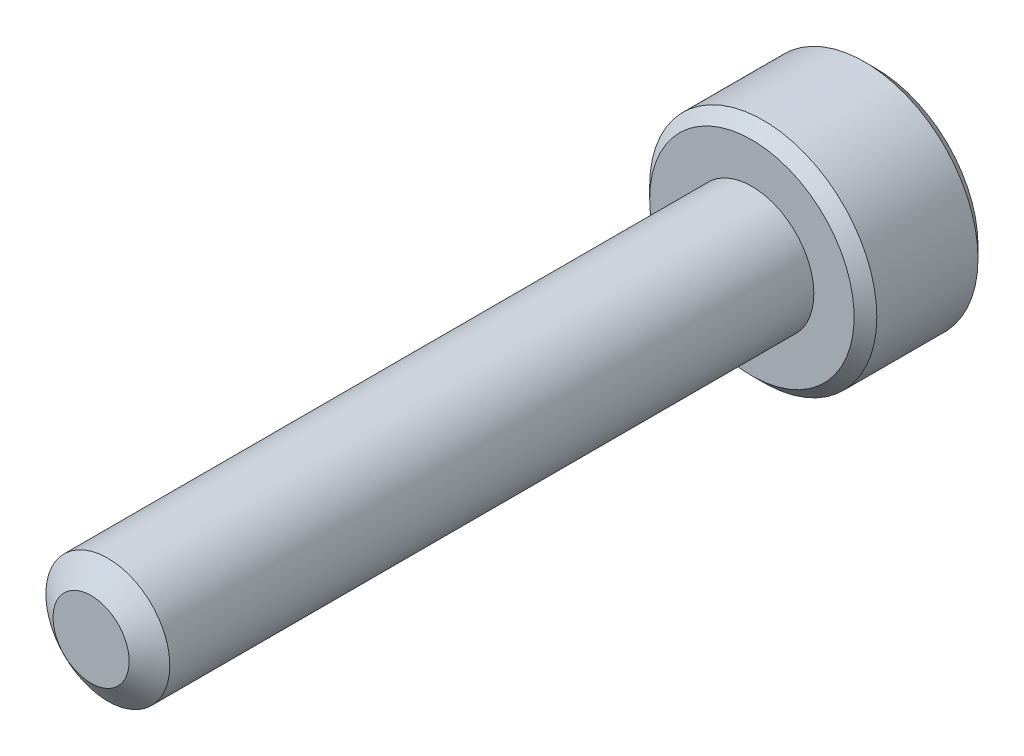
ISO-10303-21;
HEADER;
FILE_DESCRIPTION(('STEP AP214'),'2;1');
FILE_NAME('part.step','',(''),(''),'','','');
FILE_SCHEMA(('AUTOMOTIVE_DESIGN { 1 0 10303 214 1 1 1 1 }'));
ENDSEC;
DATA;
#1=APPLICATION_CONTEXT('core data for automotive mechanical design processes');
#2=APPLICATION_PROTOCOL_DEFINITION('international standard','automotive_design',2000,#1);
#3=PRODUCT_CONTEXT('',#1,'mechanical');
#4=PRODUCT('Part','Part','',(#3));
#5=PRODUCT_RELATED_PRODUCT_CATEGORY('part','',(#4));
#6=PRODUCT_DEFINITION_FORMATION('','',#4);
#7=PRODUCT_DEFINITION_CONTEXT('part definition',#1,'design');
#8=PRODUCT_DEFINITION('design','',#6,#7);
#9=PRODUCT_DEFINITION_SHAPE('','',#8);
#10=(LENGTH_UNIT() NAMED_UNIT(*) SI_UNIT(.MILLI.,.METRE.));
#11=(NAMED_UNIT(*) PLANE_ANGLE_UNIT() SI_UNIT($,.RADIAN.));
#12=(NAMED_UNIT(*) SI_UNIT($,.STERADIAN.) SOLID_ANGLE_UNIT());
#13=UNCERTAINTY_MEASURE_WITH_UNIT(LENGTH_MEASURE(1.E-05),#10,'distance_accuracy_value','');
#14=(GEOMETRIC_REPRESENTATION_CONTEXT(3) GLOBAL_UNCERTAINTY_ASSIGNED_CONTEXT((#13)) GLOBAL_UNIT_ASSIGNED_CONTEXT((#10,
#11,#12)) REPRESENTATION_CONTEXT('',''));
#15=CARTESIAN_POINT('',(0.,0.,0.));
#16=DIRECTION('',(0.,0.,1.));
#17=DIRECTION('',(1.,0.,0.));
#18=AXIS2_PLACEMENT_3D('',#15,#16,#17);
#19=CARTESIAN_POINT('',(0.,0.,-16.));
#20=DIRECTION('',(0.,0.,1.));
#21=DIRECTION('',(1.,0.,0.));
#22=AXIS2_PLACEMENT_3D('',#19,#20,#21);
#23=CYLINDRICAL_SURFACE('',#22,1.5);
#24=CARTESIAN_POINT('',(0.,0.,-16.));
#25=DIRECTION('',(0.,0.,-1.));
#26=DIRECTION('',(-1.,0.,0.));
#27=AXIS2_PLACEMENT_3D('',#24,#25,#26);
#28=CIRCLE('',#27,1.5);
#29=CARTESIAN_POINT('',(-1.5,0.,-16.));
#30=VERTEX_POINT('',#29);
#31=EDGE_CURVE('E218',#30,#30,#28,.F.);
#32=ORIENTED_EDGE('',*,*,#31,.T.);
#33=EDGE_LOOP('',(#32));
#34=FACE_BOUND('',#33,.T.);
#35=CARTESIAN_POINT('',(0.,0.,-0.40525178320938));
#36=DIRECTION('',(0.,0.,1.));
#37=DIRECTION('',(1.,0.,0.));
#38=AXIS2_PLACEMENT_3D('',#35,#36,#37);
#39=CIRCLE('',#38,1.5);
#40=CARTESIAN_POINT('',(1.5,0.,-0.40525178320938));
#41=VERTEX_POINT('',#40);
#42=EDGE_CURVE('E112',#41,#41,#39,.T.);
#43=ORIENTED_EDGE('',*,*,#42,.F.);
#44=EDGE_LOOP('',(#43));
#45=FACE_BOUND('',#44,.T.);
#46=ADVANCED_FACE('F38',(#34,#45),#23,.T.);
#47=CARTESIAN_POINT('',(0.,0.,0.));
#48=DIRECTION('',(0.,0.,-1.));
#49=DIRECTION('',(-1.,0.,0.));
#50=AXIS2_PLACEMENT_3D('',#47,#48,#49);
#51=CONICAL_SURFACE('',#50,0.921240473580834,0.959931088596884);
#52=ORIENTED_EDGE('',*,*,#42,.T.);
#53=EDGE_LOOP('',(#52));
#54=FACE_BOUND('',#53,.T.);
#55=CARTESIAN_POINT('',(0.,0.,0.));
#56=DIRECTION('',(0.,0.,1.));
#57=DIRECTION('',(1.,0.,0.));
#58=AXIS2_PLACEMENT_3D('',#55,#56,#57);
#59=CIRCLE('',#58,0.921240473580834);
#60=CARTESIAN_POINT('',(0.921240473580834,0.,0.));
#61=VERTEX_POINT('',#60);
#62=EDGE_CURVE('E216',#61,#61,#59,.T.);
#63=ORIENTED_EDGE('',*,*,#62,.F.);
#64=EDGE_LOOP('',(#63));
#65=FACE_BOUND('',#64,.T.);
#66=ADVANCED_FACE('F199',(#54,#65),#51,.T.);
#67=CARTESIAN_POINT('',(0.,0.,0.));
#68=DIRECTION('',(0.,0.,1.));
#69=DIRECTION('',(1.,0.,0.));
#70=AXIS2_PLACEMENT_3D('',#67,#68,#69);
#71=PLANE('',#70);
#72=ORIENTED_EDGE('',*,*,#62,.T.);
#73=EDGE_LOOP('',(#72));
#74=FACE_BOUND('',#73,.T.);
#75=ADVANCED_FACE('F196',(#74),#71,.T.);
#76=CARTESIAN_POINT('',(0.,0.,-19.));
#77=DIRECTION('',(0.,0.,1.));
#78=DIRECTION('',(1.,0.,0.));
#79=AXIS2_PLACEMENT_3D('',#76,#77,#78);
#80=CYLINDRICAL_SURFACE('',#79,2.75);
#81=CARTESIAN_POINT('',(0.,0.,-18.725));
#82=DIRECTION('',(0.,0.,-1.));
#83=DIRECTION('',(-1.,0.,0.));
#84=AXIS2_PLACEMENT_3D('',#81,#82,#83);
#85=CIRCLE('',#84,2.75);
#86=CARTESIAN_POINT('',(2.75,0.,-18.725));
#87=VERTEX_POINT('',#86);
#88=EDGE_CURVE('E46',#87,#87,#85,.F.);
#89=CARTESIAN_POINT('',(0.,0.,-16.275));
#90=DIRECTION('',(0.,0.,-1.));
#91=DIRECTION('',(-1.,0.,0.));
#92=AXIS2_PLACEMENT_3D('',#89,#90,#91);
#93=CIRCLE('',#92,2.75);
#94=CARTESIAN_POINT('',(2.75,0.,-16.275));
#95=VERTEX_POINT('',#94);
#96=EDGE_CURVE('E175',#95,#95,#93,.T.);
#97=CARTESIAN_POINT('',(2.75,0.,-18.725));
#98=CARTESIAN_POINT('',(2.75,0.,-18.6994791666667));
#99=CARTESIAN_POINT('',(2.75,0.,-18.6739583333333));
#100=CARTESIAN_POINT('',(2.75,0.,-18.6229166666667));
#101=CARTESIAN_POINT('',(2.75,0.,-18.5973958333333));
#102=CARTESIAN_POINT('',(2.75,0.,-18.5463541666667));
#103=CARTESIAN_POINT('',(2.75,0.,-18.5208333333333));
#104=CARTESIAN_POINT('',(2.75,0.,-18.4697916666667));
#105=CARTESIAN_POINT('',(2.75,0.,-18.4442708333333));
#106=CARTESIAN_POINT('',(2.75,0.,-18.3932291666667));
#107=CARTESIAN_POINT('',(2.75,0.,-18.3677083333333));
#108=CARTESIAN_POINT('',(2.75,0.,-18.3166666666667));
#109=CARTESIAN_POINT('',(2.75,0.,-18.2911458333333));
#110=CARTESIAN_POINT('',(2.75,0.,-18.2401041666667));
#111=CARTESIAN_POINT('',(2.75,0.,-18.2145833333333));
#112=CARTESIAN_POINT('',(2.75,0.,-18.1635416666667));
#113=CARTESIAN_POINT('',(2.75,0.,-18.1380208333333));
#114=CARTESIAN_POINT('',(2.75,0.,-18.0869791666667));
#115=CARTESIAN_POINT('',(2.75,0.,-18.0614583333333));
#116=CARTESIAN_POINT('',(2.75,0.,-18.0104166666667));
#117=CARTESIAN_POINT('',(2.75,0.,-17.9848958333333));
#118=CARTESIAN_POINT('',(2.75,0.,-17.9338541666667));
#119=CARTESIAN_POINT('',(2.75,0.,-17.9083333333333));
#120=CARTESIAN_POINT('',(2.75,0.,-17.8572916666667));
#121=CARTESIAN_POINT('',(2.75,0.,-17.8317708333333));
#122=CARTESIAN_POINT('',(2.75,0.,-17.7807291666667));
#123=CARTESIAN_POINT('',(2.75,0.,-17.7552083333333));
#124=CARTESIAN_POINT('',(2.75,0.,-17.7041666666667));
#125=CARTESIAN_POINT('',(2.75,0.,-17.6786458333333));
#126=CARTESIAN_POINT('',(2.75,0.,-17.6276041666667));
#127=CARTESIAN_POINT('',(2.75,0.,-17.6020833333333));
#128=CARTESIAN_POINT('',(2.75,0.,-17.5510416666667));
#129=CARTESIAN_POINT('',(2.75,0.,-17.5255208333333));
#130=CARTESIAN_POINT('',(2.75,0.,-17.4744791666667));
#131=CARTESIAN_POINT('',(2.75,0.,-17.4489583333333));
#132=CARTESIAN_POINT('',(2.75,0.,-17.3979166666667));
#133=CARTESIAN_POINT('',(2.75,0.,-17.3723958333333));
#134=CARTESIAN_POINT('',(2.75,0.,-17.3213541666667));
#135=CARTESIAN_POINT('',(2.75,0.,-17.2958333333333));
#136=CARTESIAN_POINT('',(2.75,0.,-17.2447916666667));
#137=CARTESIAN_POINT('',(2.75,0.,-17.2192708333333));
#138=CARTESIAN_POINT('',(2.75,0.,-17.1682291666667));
#139=CARTESIAN_POINT('',(2.75,0.,-17.1427083333333));
#140=CARTESIAN_POINT('',(2.75,0.,-17.0916666666667));
#141=CARTESIAN_POINT('',(2.75,0.,-17.0661458333333));
#142=CARTESIAN_POINT('',(2.75,0.,-17.0151041666667));
#143=CARTESIAN_POINT('',(2.75,0.,-16.9895833333333));
#144=CARTESIAN_POINT('',(2.75,0.,-16.9385416666667));
#145=CARTESIAN_POINT('',(2.75,0.,-16.9130208333333));
#146=CARTESIAN_POINT('',(2.75,0.,-16.8619791666667));
#147=CARTESIAN_POINT('',(2.75,0.,-16.8364583333333));
#148=CARTESIAN_POINT('',(2.75,0.,-16.7854166666667));
#149=CARTESIAN_POINT('',(2.75,0.,-16.7598958333333));
#150=CARTESIAN_POINT('',(2.75,0.,-16.7088541666667));
#151=CARTESIAN_POINT('',(2.75,0.,-16.6833333333333));
#152=CARTESIAN_POINT('',(2.75,0.,-16.6322916666667));
#153=CARTESIAN_POINT('',(2.75,0.,-16.6067708333333));
#154=CARTESIAN_POINT('',(2.75,0.,-16.5557291666667));
#155=CARTESIAN_POINT('',(2.75,0.,-16.5302083333333));
#156=CARTESIAN_POINT('',(2.75,0.,-16.4791666666667));
#157=CARTESIAN_POINT('',(2.75,0.,-16.4536458333333));
#158=CARTESIAN_POINT('',(2.75,0.,-16.4026041666667));
#159=CARTESIAN_POINT('',(2.75,0.,-16.3770833333333));
#160=CARTESIAN_POINT('',(2.75,0.,-16.3260416666667));
#161=CARTESIAN_POINT('',(2.75,0.,-16.3005208333333));
#162=CARTESIAN_POINT('',(2.75,0.,-16.275));
#163=B_SPLINE_CURVE_WITH_KNOTS('',3,(#97,#98,#99,#100,#101,#102,#103,#104,#105,#106,#107,#108,
#109,#110,#111,#112,#113,#114,#115,#116,#117,#118,#119,#120,#121,#122,#123,#124,#125,#126,#127,
#128,#129,#130,#131,#132,#133,#134,#135,#136,#137,#138,#139,#140,#141,#142,#143,#144,#145,#146,
#147,#148,#149,#150,#151,#152,#153,#154,#155,#156,#157,#158,#159,#160,#161,#162),.UNSPECIFIED.,
.F.,.F.,(4,2,2,2,2,2,2,2,2,2,2,2,2,2,2,2,2,2,2,2,2,2,2,2,2,2,2,2,2,2,2,2,4),(0.,
0.076562500000002,0.153125,0.229687500000002,0.306250000000001,0.382812500000003,
0.459375000000001,0.5359375,0.612500000000002,0.6890625,0.765625000000002,0.842187500000001,
0.918749999999999,0.995312500000001,1.071875,1.1484375,1.225,1.3015625,1.378125,1.4546875,
1.53125,1.6078125,1.684375,1.7609375,1.8375,1.9140625,1.990625,2.0671875,2.14375,2.2203125,
2.296875,2.3734375,2.45),.UNSPECIFIED.);
#164=EDGE_CURVE('BSEAM180',#87,#95,#163,.T.);
#165=ORIENTED_EDGE('',*,*,#88,.T.);
#166=ORIENTED_EDGE('',*,*,#96,.T.);
#167=ORIENTED_EDGE('',*,*,#164,.T.);
#168=ORIENTED_EDGE('',*,*,#164,.F.);
#169=EDGE_LOOP('',(#165,#167,#166,#168));
#170=FACE_BOUND('',#169,.T.);
#171=ADVANCED_FACE('F180',(#170),#80,.T.);
#172=CARTESIAN_POINT('',(0.,0.,-19.));
#173=DIRECTION('',(0.,0.,-1.));
#174=DIRECTION('',(-1.,0.,0.));
#175=AXIS2_PLACEMENT_3D('',#172,#173,#174);
#176=PLANE('',#175);
#177=CARTESIAN_POINT('',(0.,0.,-19.));
#178=DIRECTION('',(0.,0.,-1.));
#179=DIRECTION('',(-1.,0.,0.));
#180=AXIS2_PLACEMENT_3D('',#177,#178,#179);
#181=CIRCLE('',#180,2.475);
#182=CARTESIAN_POINT('',(2.475,0.,-19.));
#183=VERTEX_POINT('',#182);
#184=EDGE_CURVE('E111',#183,#183,#181,.T.);
#185=ORIENTED_EDGE('',*,*,#184,.T.);
#186=EDGE_LOOP('',(#185));
#187=FACE_BOUND('',#186,.T.);
#188=CARTESIAN_POINT('',(0.,0.,-19.));
#189=DIRECTION('',(0.,0.,-1.));
#190=DIRECTION('',(-1.,0.,0.));
#191=AXIS2_PLACEMENT_3D('',#188,#189,#190);
#192=CIRCLE('',#191,1.44337567297406);
#193=CARTESIAN_POINT('',(-1.25,0.721687836487031,-19.));
#194=VERTEX_POINT('',#193);
#195=CARTESIAN_POINT('',(0.,1.44337567297406,-19.));
#196=VERTEX_POINT('',#195);
#197=EDGE_CURVE('E92',#194,#196,#192,.T.);
#198=ORIENTED_EDGE('',*,*,#197,.F.);
#199=CARTESIAN_POINT('',(-1.25,-0.721687836487032,-19.));
#200=VERTEX_POINT('',#199);
#201=EDGE_CURVE('E52',#200,#194,#192,.T.);
#202=ORIENTED_EDGE('',*,*,#201,.F.);
#203=CARTESIAN_POINT('',(0.,-1.44337567297406,-19.));
#204=VERTEX_POINT('',#203);
#205=EDGE_CURVE('E277',#204,#200,#192,.T.);
#206=ORIENTED_EDGE('',*,*,#205,.F.);
#207=CARTESIAN_POINT('',(1.25,-0.721687836487032,-19.));
#208=VERTEX_POINT('',#207);
#209=EDGE_CURVE('E59',#208,#204,#192,.T.);
#210=ORIENTED_EDGE('',*,*,#209,.F.);
#211=CARTESIAN_POINT('',(1.25,0.721687836487033,-19.));
#212=VERTEX_POINT('',#211);
#213=EDGE_CURVE('E133',#212,#208,#192,.T.);
#214=ORIENTED_EDGE('',*,*,#213,.F.);
#215=EDGE_CURVE('E101',#196,#212,#192,.T.);
#216=ORIENTED_EDGE('',*,*,#215,.F.);
#217=EDGE_LOOP('',(#198,#202,#206,#210,#214,#216));
#218=FACE_BOUND('',#217,.T.);
#219=ADVANCED_FACE('F132',(#187,#218),#176,.T.);
#220=CARTESIAN_POINT('',(0.,0.,-16.));
#221=DIRECTION('',(0.,0.,-1.));
#222=DIRECTION('',(-1.,0.,0.));
#223=AXIS2_PLACEMENT_3D('',#220,#221,#222);
#224=PLANE('',#223);
#225=CARTESIAN_POINT('',(0.,0.,-16.));
#226=DIRECTION('',(0.,0.,-1.));
#227=DIRECTION('',(-1.,0.,0.));
#228=AXIS2_PLACEMENT_3D('',#225,#226,#227);
#229=CIRCLE('',#228,2.475);
#230=CARTESIAN_POINT('',(-2.475,0.,-16.));
#231=VERTEX_POINT('',#230);
#232=EDGE_CURVE('E11',#231,#231,#229,.F.);
#233=ORIENTED_EDGE('',*,*,#232,.T.);
#234=EDGE_LOOP('',(#233));
#235=FACE_BOUND('',#234,.T.);
#236=ORIENTED_EDGE('',*,*,#31,.F.);
#237=EDGE_LOOP('',(#236));
#238=FACE_BOUND('',#237,.T.);
#239=ADVANCED_FACE('F189',(#235,#238),#224,.F.);
#240=CARTESIAN_POINT('',(0.,0.,-19.));
#241=DIRECTION('',(0.,0.,-1.));
#242=DIRECTION('',(-1.,0.,0.));
#243=AXIS2_PLACEMENT_3D('',#240,#241,#242);
#244=CONICAL_SURFACE('',#243,1.44337567297406,0.78539816339745);
#245=ORIENTED_EDGE('',*,*,#215,.T.);
#246=CARTESIAN_POINT('',(-0.000200000000000119,1.4434911430279,-19.0001154839091));
#247=CARTESIAN_POINT('',(0.0427751670715865,1.41867941875065,-18.9753216680551));
#248=CARTESIAN_POINT('',(0.0864690047459473,1.39345276980743,-18.9519837344187));
#249=CARTESIAN_POINT('',(0.17556593084194,1.34201263554194,-18.9092520040845));
#250=CARTESIAN_POINT('',(0.220977498357062,1.31579425481276,-18.8898819923604));
#251=CARTESIAN_POINT('',(0.312547820935257,1.26292610442246,-18.8567004834135));
#252=CARTESIAN_POINT('',(0.358683240175883,1.23628980770471,-18.8428055590527));
#253=CARTESIAN_POINT('',(0.451970080407589,1.18243062538509,-18.8213972821606));
#254=CARTESIAN_POINT('',(0.499118649136376,1.15520938653762,-18.8138679415668));
#255=CARTESIAN_POINT('',(0.580373556887248,1.10829684367467,-18.8070744980507));
#256=CARTESIAN_POINT('',(0.614374876627936,1.08866617256958,-18.8060685591044));
#257=CARTESIAN_POINT('',(0.682317764432473,1.04943932800611,-18.8077614149113));
#258=CARTESIAN_POINT('',(0.716259317655653,1.029843163116,-18.8104610272155));
#259=CARTESIAN_POINT('',(0.783814856457495,0.990839954603502,-18.8194089303164));
#260=CARTESIAN_POINT('',(0.81742850728677,0.971433104248774,-18.8256605258997));
#261=CARTESIAN_POINT('',(0.884094638217808,0.932943395609908,-18.8413756814139));
#262=CARTESIAN_POINT('',(0.917146871030291,0.913860680098303,-18.8508406200875));
#263=CARTESIAN_POINT('',(1.00179969160026,0.86498635135457,-18.8789313906876));
#264=CARTESIAN_POINT('',(1.05286649242963,0.835502920149078,-18.8996701574522));
#265=CARTESIAN_POINT('',(1.15300085411325,0.777690319475909,-18.9463871346715));
#266=CARTESIAN_POINT('',(1.20207431157827,0.749357745598417,-18.9723482959468));
#267=CARTESIAN_POINT('',(1.2502,0.721572366433194,-19.0001154839091));
#268=B_SPLINE_CURVE_WITH_KNOTS('',3,(#246,#247,#248,#249,#250,#251,#252,#253,#254,#255,#256,
#257,#258,#259,#260,#261,#262,#263,#264,#265,#266,#267),.UNSPECIFIED.,.F.,.F.,(4,2,2,2,2,2,2,2,
2,2,4),(0.,0.166533409618302,0.33403760728976,0.498880396489694,0.66330791924027,
0.780963963458822,0.898645970148448,1.01643764860773,1.13427993171549,1.32148652032141,
1.50809158792574),.UNSPECIFIED.);
#269=EDGE_CURVE('E106',#196,#212,#268,.T.);
#270=ORIENTED_EDGE('',*,*,#269,.F.);
#271=EDGE_LOOP('',(#245,#270));
#272=FACE_BOUND('',#271,.T.);
#273=ADVANCED_FACE('F107',(#272),#244,.F.);
#274=ORIENTED_EDGE('',*,*,#213,.T.);
#275=CARTESIAN_POINT('',(1.25,-1.43934010808077,-19.4629820968923));
#276=CARTESIAN_POINT('',(1.25,-1.40429313005659,-19.4365249226329));
#277=CARTESIAN_POINT('',(1.25,-1.36905087135599,-19.4103271603543));
#278=CARTESIAN_POINT('',(1.25,-1.29809650706311,-19.3585575718396));
#279=CARTESIAN_POINT('',(1.25,-1.26238428576496,-19.3329859043563));
#280=CARTESIAN_POINT('',(1.25,-1.15390111792708,-19.2570059936895));
#281=CARTESIAN_POINT('',(1.25,-1.08031646726264,-19.2077402861896));
#282=CARTESIAN_POINT('',(1.25,-0.926012322755096,-19.1110258302631));
#283=CARTESIAN_POINT('',(1.25,-0.845125318656147,-19.0638412989418));
#284=CARTESIAN_POINT('',(1.25,-0.679311174076602,-18.9775307343904));
#285=CARTESIAN_POINT('',(1.25,-0.594398891026687,-18.9383775346269));
#286=CARTESIAN_POINT('',(1.25,-0.46694481246074,-18.8904772236883));
#287=CARTESIAN_POINT('',(1.25,-0.426289985812822,-18.8767294897863));
#288=CARTESIAN_POINT('',(1.25,-0.343998850091267,-18.8524979274505));
#289=CARTESIAN_POINT('',(1.25,-0.302362473614961,-18.8420143238698));
#290=CARTESIAN_POINT('',(1.25,-0.219052696285665,-18.8250301617483));
#291=CARTESIAN_POINT('',(1.25,-0.177393428474499,-18.8184613604714));
#292=CARTESIAN_POINT('',(1.25,-0.093629369340192,-18.8094350534578));
#293=CARTESIAN_POINT('',(1.25,-0.051524655854396,-18.8069768409973));
#294=CARTESIAN_POINT('',(1.25,0.0311890576306313,-18.8063540620133));
#295=CARTESIAN_POINT('',(1.25,0.07179696254993,-18.8080371168462));
#296=CARTESIAN_POINT('',(1.25,0.152668636885197,-18.8152682705979));
#297=CARTESIAN_POINT('',(1.25,0.192932338835358,-18.8208171104131));
#298=CARTESIAN_POINT('',(1.25,0.273499879165295,-18.835571036465));
#299=CARTESIAN_POINT('',(1.25,0.31379218061851,-18.8448381759641));
#300=CARTESIAN_POINT('',(1.25,0.393496413911457,-18.8665361784573));
#301=CARTESIAN_POINT('',(1.25,0.432908419115059,-18.8789667767306));
#302=CARTESIAN_POINT('',(1.25,0.556992735862299,-18.9227793529314));
#303=CARTESIAN_POINT('',(1.25,0.639898924666086,-18.959151072876));
#304=CARTESIAN_POINT('',(1.25,0.801816555499702,-19.0400191621783));
#305=CARTESIAN_POINT('',(1.25,0.880812666325045,-19.084544720912));
#306=CARTESIAN_POINT('',(1.25,1.0317856127975,-19.1764048766666));
#307=CARTESIAN_POINT('',(1.25,1.10391618485086,-19.2234899339162));
#308=CARTESIAN_POINT('',(1.25,1.21018606043311,-19.2962785615985));
#309=CARTESIAN_POINT('',(1.25,1.24515069969379,-19.3207980853934));
#310=CARTESIAN_POINT('',(1.25,1.31460220852737,-19.3704856367657));
#311=CARTESIAN_POINT('',(1.25,1.34908920596618,-19.3956534854155));
#312=CARTESIAN_POINT('',(1.25,1.38337731682912,-19.4210901488412));
#313=B_SPLINE_CURVE_WITH_KNOTS('',3,(#275,#276,#277,#278,#279,#280,#281,#282,#283,#284,#285,
#286,#287,#288,#289,#290,#291,#292,#293,#294,#295,#296,#297,#298,#299,#300,#301,#302,#303,#304,
#305,#306,#307,#308,#309,#310,#311,#312),.UNSPECIFIED.,.F.,.F.,(4,2,2,2,2,2,2,2,2,2,2,2,2,2,2,2,
2,2,4),(0.,0.131732960381448,0.263498984161645,0.529042014455827,0.809741926134622,
1.08947609717225,1.21811634272577,1.34676544783901,1.47310084517844,1.59941451973785,
1.7211504216785,1.84290966131735,1.96679153905342,2.09066305366039,2.36146692896009,
2.63325989198491,2.8915466821228,3.01965734507713,3.14773302245628),.UNSPECIFIED.);
#314=EDGE_CURVE('E100',#212,#208,#313,.F.);
#315=ORIENTED_EDGE('',*,*,#314,.F.);
#316=EDGE_LOOP('',(#274,#315));
#317=FACE_BOUND('',#316,.T.);
#318=ADVANCED_FACE('F283',(#317),#244,.F.);
#319=ORIENTED_EDGE('',*,*,#209,.T.);
#320=CARTESIAN_POINT('',(1.2502,-0.721572366433195,-19.0001154839091));
#321=CARTESIAN_POINT('',(1.20722483292841,-0.746384090710444,-18.9753216680551));
#322=CARTESIAN_POINT('',(1.16353099525405,-0.771610739653665,-18.9519837344187));
#323=CARTESIAN_POINT('',(1.07443406915806,-0.823050873919155,-18.9092520040845));
#324=CARTESIAN_POINT('',(1.02902250164294,-0.849269254648333,-18.8898819923604));
#325=CARTESIAN_POINT('',(0.93745217906474,-0.902137405038636,-18.8567004834135));
#326=CARTESIAN_POINT('',(0.891316759824114,-0.928773701756388,-18.8428055590527));
#327=CARTESIAN_POINT('',(0.798029919592407,-0.982632884076014,-18.8213972821606));
#328=CARTESIAN_POINT('',(0.750881350863619,-1.00985412292348,-18.8138679415668));
#329=CARTESIAN_POINT('',(0.669626443112747,-1.05676666578643,-18.8070744980507));
#330=CARTESIAN_POINT('',(0.635625123372058,-1.07639733689152,-18.8060685591044));
#331=CARTESIAN_POINT('',(0.567682235567521,-1.11562418145499,-18.8077614149113));
#332=CARTESIAN_POINT('',(0.533740682344341,-1.1352203463451,-18.8104610272155));
#333=CARTESIAN_POINT('',(0.466185143542499,-1.1742235548576,-18.8194089303164));
#334=CARTESIAN_POINT('',(0.432571492713224,-1.19363040521233,-18.8256605258997));
#335=CARTESIAN_POINT('',(0.365905361782186,-1.23212011385119,-18.8413756814139));
#336=CARTESIAN_POINT('',(0.332853128969703,-1.2512028293628,-18.8508406200875));
#337=CARTESIAN_POINT('',(0.248200308399734,-1.30007715810653,-18.8789313906876));
#338=CARTESIAN_POINT('',(0.19713350757036,-1.32956058931202,-18.8996701574522));
#339=CARTESIAN_POINT('',(0.0969991458867441,-1.38737318998519,-18.9463871346715));
#340=CARTESIAN_POINT('',(0.0479256884217299,-1.41570576386268,-18.9723482959468));
#341=CARTESIAN_POINT('',(-0.000199999999999849,-1.4434911430279,-19.0001154839091));
#342=B_SPLINE_CURVE_WITH_KNOTS('',3,(#320,#321,#322,#323,#324,#325,#326,#327,#328,#329,#330,
#331,#332,#333,#334,#335,#336,#337,#338,#339,#340,#341),.UNSPECIFIED.,.F.,.F.,(4,2,2,2,2,2,2,2,
2,2,4),(0.,0.166533409618303,0.334037607289763,0.4988803964897,0.663307919240276,
0.780963963458829,0.898645970148455,1.01643764860773,1.1342799317155,1.32148652032141,
1.50809158792574),.UNSPECIFIED.);
#343=EDGE_CURVE('E143',#208,#204,#342,.T.);
#344=ORIENTED_EDGE('',*,*,#343,.F.);
#345=EDGE_LOOP('',(#319,#344));
#346=FACE_BOUND('',#345,.T.);
#347=ADVANCED_FACE('F280',(#346),#244,.F.);
#348=ORIENTED_EDGE('',*,*,#205,.T.);
#349=CARTESIAN_POINT('',(0.000200000000000315,-1.4434911430279,-19.0001154839091));
#350=CARTESIAN_POINT('',(-0.0427751670715866,-1.41867941875065,-18.9753216680551));
#351=CARTESIAN_POINT('',(-0.0864690047459478,-1.39345276980743,-18.9519837344187));
#352=CARTESIAN_POINT('',(-0.175565930841942,-1.34201263554194,-18.9092520040845));
#353=CARTESIAN_POINT('',(-0.220977498357064,-1.31579425481276,-18.8898819923604));
#354=CARTESIAN_POINT('',(-0.31254782093526,-1.26292610442246,-18.8567004834135));
#355=CARTESIAN_POINT('',(-0.358683240175886,-1.23628980770471,-18.8428055590527));
#356=CARTESIAN_POINT('',(-0.451970080407593,-1.18243062538508,-18.8213972821606));
#357=CARTESIAN_POINT('',(-0.49911864913638,-1.15520938653761,-18.8138679415668));
#358=CARTESIAN_POINT('',(-0.580373556887253,-1.10829684367467,-18.8070744980507));
#359=CARTESIAN_POINT('',(-0.614374876627942,-1.08866617256958,-18.8060685591044));
#360=CARTESIAN_POINT('',(-0.682317764432478,-1.04943932800611,-18.8077614149113));
#361=CARTESIAN_POINT('',(-0.716259317655658,-1.02984316311599,-18.8104610272155));
#362=CARTESIAN_POINT('',(-0.783814856457501,-0.990839954603499,-18.8194089303164));
#363=CARTESIAN_POINT('',(-0.817428507286776,-0.971433104248771,-18.8256605258997));
#364=CARTESIAN_POINT('',(-0.884094638217814,-0.932943395609905,-18.8413756814139));
#365=CARTESIAN_POINT('',(-0.917146871030296,-0.9138606800983,-18.8508406200875));
#366=CARTESIAN_POINT('',(-1.00179969160027,-0.864986351354568,-18.8789313906876));
#367=CARTESIAN_POINT('',(-1.05286649242964,-0.835502920149076,-18.8996701574522));
#368=CARTESIAN_POINT('',(-1.15300085411326,-0.777690319475908,-18.9463871346715));
#369=CARTESIAN_POINT('',(-1.20207431157827,-0.749357745598416,-18.9723482959468));
#370=CARTESIAN_POINT('',(-1.2502,-0.721572366433194,-19.0001154839091));
#371=B_SPLINE_CURVE_WITH_KNOTS('',3,(#349,#350,#351,#352,#353,#354,#355,#356,#357,#358,#359,
#360,#361,#362,#363,#364,#365,#366,#367,#368,#369,#370),.UNSPECIFIED.,.F.,.F.,(4,2,2,2,2,2,2,2,
2,2,4),(0.,0.166533409618304,0.334037607289763,0.498880396489699,0.663307919240276,
0.780963963458828,0.898645970148455,1.01643764860773,1.1342799317155,1.32148652032141,
1.50809158792574),.UNSPECIFIED.);
#372=EDGE_CURVE('E254',#204,#200,#371,.T.);
#373=ORIENTED_EDGE('',*,*,#372,.F.);
#374=EDGE_LOOP('',(#348,#373));
#375=FACE_BOUND('',#374,.T.);
#376=ADVANCED_FACE('F279',(#375),#244,.F.);
#377=ORIENTED_EDGE('',*,*,#201,.T.);
#378=CARTESIAN_POINT('',(-1.25,-1.43934010829019,-19.4629820970504));
#379=CARTESIAN_POINT('',(-1.25,-1.40429313026013,-19.4365249227849));
#380=CARTESIAN_POINT('',(-1.25,-1.36905087155364,-19.4103271605002));
#381=CARTESIAN_POINT('',(-1.25,-1.29809650724891,-19.3585575719734));
#382=CARTESIAN_POINT('',(-1.25,-1.2623842859448,-19.3329859044841));
#383=CARTESIAN_POINT('',(-1.25,-1.1539011180887,-19.257005993799));
#384=CARTESIAN_POINT('',(-1.25,-1.08031646741188,-19.207740286287));
#385=CARTESIAN_POINT('',(-1.25,-0.926012322877301,-19.1110258303356));
#386=CARTESIAN_POINT('',(-1.25,-0.845125318763647,-19.0638412990016));
#387=CARTESIAN_POINT('',(-1.25,-0.679311174153443,-18.9775307344266));
#388=CARTESIAN_POINT('',(-1.25,-0.594398891087584,-18.9383775346522));
#389=CARTESIAN_POINT('',(-1.25,-0.46694481250964,-18.8904772237056));
#390=CARTESIAN_POINT('',(-1.25,-0.426289985866745,-18.8767294898039));
#391=CARTESIAN_POINT('',(-1.25,-0.343998850155403,-18.8524979274677));
#392=CARTESIAN_POINT('',(-1.25,-0.302362473684287,-18.8420143238863));
#393=CARTESIAN_POINT('',(-1.25,-0.219052696365196,-18.8250301617622));
#394=CARTESIAN_POINT('',(-1.25,-0.177393428559045,-18.8184613604834));
#395=CARTESIAN_POINT('',(-1.25,-0.093629369434599,-18.809435053465));
#396=CARTESIAN_POINT('',(-1.25,-0.0515246559536497,-18.8069768410015));
#397=CARTESIAN_POINT('',(-1.25,0.0311890575224381,-18.8063540620107));
#398=CARTESIAN_POINT('',(-1.25,0.0717969624376313,-18.8080371168399));
#399=CARTESIAN_POINT('',(-1.25,0.152668636765092,-18.8152682705835));
#400=CARTESIAN_POINT('',(-1.25,0.192932338711553,-18.8208171103943));
#401=CARTESIAN_POINT('',(-1.25,0.273499879034188,-18.835571036437));
#402=CARTESIAN_POINT('',(-1.25,0.313792180483813,-18.8448381759314));
#403=CARTESIAN_POINT('',(-1.25,0.393496413769924,-18.8665361784149));
#404=CARTESIAN_POINT('',(-1.25,0.432908418970282,-18.8789667766833));
#405=CARTESIAN_POINT('',(-1.25,0.556992735685997,-18.9227793528609));
#406=CARTESIAN_POINT('',(-1.25,0.639898924463083,-18.9591510727842));
#407=CARTESIAN_POINT('',(-1.25,0.801816555245347,-19.0400191620416));
#408=CARTESIAN_POINT('',(-1.25,0.880812666046051,-19.0845447207516));
#409=CARTESIAN_POINT('',(-1.25,1.03178561247421,-19.176404876461));
#410=CARTESIAN_POINT('',(-1.25,1.10391618450775,-19.2234899336892));
#411=CARTESIAN_POINT('',(-1.25,1.2101860600607,-19.2962785613395));
#412=CARTESIAN_POINT('',(-1.25,1.24515069931176,-19.3207980851238));
#413=CARTESIAN_POINT('',(-1.25,1.31460220812614,-19.3704856364749));
#414=CARTESIAN_POINT('',(-1.25,1.34908920555539,-19.3956534851142));
#415=CARTESIAN_POINT('',(-1.25,1.38337731640878,-19.4210901485293));
#416=B_SPLINE_CURVE_WITH_KNOTS('',3,(#378,#379,#380,#381,#382,#383,#384,#385,#386,#387,#388,
#389,#390,#391,#392,#393,#394,#395,#396,#397,#398,#399,#400,#401,#402,#403,#404,#405,#406,#407,
#408,#409,#410,#411,#412,#413,#414,#415),.UNSPECIFIED.,.F.,.F.,(4,2,2,2,2,2,2,2,2,2,2,2,2,2,2,2,
2,2,4),(0.,0.131732960406523,0.263498984211801,0.529042014557081,0.809741926293181,
1.08947609738757,1.21811634292656,1.34676544802529,1.47310084535082,1.59941451989631,
1.72115042182424,1.84290966145034,1.96679153917269,2.09066305376595,2.36146692896707,
2.63325989189266,2.89154668194564,3.01965734485811,3.14773302219539),.UNSPECIFIED.);
#417=EDGE_CURVE('E122',#200,#194,#416,.T.);
#418=ORIENTED_EDGE('',*,*,#417,.F.);
#419=EDGE_LOOP('',(#377,#418));
#420=FACE_BOUND('',#419,.T.);
#421=ADVANCED_FACE('F292',(#420),#244,.F.);
#422=ORIENTED_EDGE('',*,*,#197,.T.);
#423=CARTESIAN_POINT('',(-1.2502,0.721572366433194,-19.0001154839091));
#424=CARTESIAN_POINT('',(-1.20722483292841,0.746384090710444,-18.9753216680551));
#425=CARTESIAN_POINT('',(-1.16353099525405,0.771610739653664,-18.9519837344187));
#426=CARTESIAN_POINT('',(-1.07443406915806,0.823050873919154,-18.9092520040845));
#427=CARTESIAN_POINT('',(-1.02902250164294,0.849269254648332,-18.8898819923604));
#428=CARTESIAN_POINT('',(-0.937452179064742,0.902137405038634,-18.8567004834135));
#429=CARTESIAN_POINT('',(-0.891316759824116,0.928773701756386,-18.8428055590527));
#430=CARTESIAN_POINT('',(-0.79802991959241,0.982632884076011,-18.8213972821606));
#431=CARTESIAN_POINT('',(-0.750881350863623,1.00985412292348,-18.8138679415668));
#432=CARTESIAN_POINT('',(-0.669626443112751,1.05676666578643,-18.8070744980507));
#433=CARTESIAN_POINT('',(-0.635625123372062,1.07639733689152,-18.8060685591043));
#434=CARTESIAN_POINT('',(-0.567682235567526,1.11562418145498,-18.8077614149113));
#435=CARTESIAN_POINT('',(-0.533740682344346,1.1352203463451,-18.8104610272155));
#436=CARTESIAN_POINT('',(-0.466185143542504,1.1742235548576,-18.8194089303164));
#437=CARTESIAN_POINT('',(-0.432571492713229,1.19363040521232,-18.8256605258997));
#438=CARTESIAN_POINT('',(-0.36590536178219,1.23212011385119,-18.8413756814139));
#439=CARTESIAN_POINT('',(-0.332853128969708,1.25120282936279,-18.8508406200875));
#440=CARTESIAN_POINT('',(-0.248200308399738,1.30007715810653,-18.8789313906876));
#441=CARTESIAN_POINT('',(-0.197133507570365,1.32956058931202,-18.8996701574522));
#442=CARTESIAN_POINT('',(-0.0969991458867474,1.38737318998519,-18.9463871346715));
#443=CARTESIAN_POINT('',(-0.0479256884217316,1.41570576386268,-18.9723482959468));
#444=CARTESIAN_POINT('',(0.000200000000001136,1.4434911430279,-19.0001154839091));
#445=B_SPLINE_CURVE_WITH_KNOTS('',3,(#423,#424,#425,#426,#427,#428,#429,#430,#431,#432,#433,
#434,#435,#436,#437,#438,#439,#440,#441,#442,#443,#444),.UNSPECIFIED.,.F.,.F.,(4,2,2,2,2,2,2,2,
2,2,4),(0.,0.166533409618303,0.334037607289761,0.498880396489697,0.663307919240272,
0.780963963458824,0.89864597014845,1.01643764860773,1.13427993171549,1.32148652032141,
1.50809158792574),.UNSPECIFIED.);
#446=EDGE_CURVE('E96',#194,#196,#445,.T.);
#447=ORIENTED_EDGE('',*,*,#446,.F.);
#448=EDGE_LOOP('',(#422,#447));
#449=FACE_BOUND('',#448,.T.);
#450=ADVANCED_FACE('F94',(#449),#244,.F.);
#451=CARTESIAN_POINT('',(1.25,2.1650635094611,-17.125));
#452=DIRECTION('',(0.,0.,-1.));
#453=DIRECTION('',(-1.,0.,0.));
#454=AXIS2_PLACEMENT_3D('',#451,#452,#453);
#455=PLANE('',#454);
#456=DIRECTION('',(0.866025403784439,0.5,0.));
#457=VECTOR('',#456,1.);
#458=CARTESIAN_POINT('',(-1.25,0.721687836487032,-17.125));
#459=LINE('',#458,#457);
#460=CARTESIAN_POINT('',(-1.25,0.721687836487032,-17.125));
#461=VERTEX_POINT('',#460);
#462=CARTESIAN_POINT('',(0.,1.44337567297406,-17.125));
#463=VERTEX_POINT('',#462);
#464=EDGE_CURVE('E121',#461,#463,#459,.T.);
#465=ORIENTED_EDGE('',*,*,#464,.T.);
#466=DIRECTION('',(0.866025403784439,-0.5,0.));
#467=VECTOR('',#466,1.);
#468=CARTESIAN_POINT('',(0.,1.44337567297406,-17.125));
#469=LINE('',#468,#467);
#470=CARTESIAN_POINT('',(1.25,0.721687836487032,-17.125));
#471=VERTEX_POINT('',#470);
#472=EDGE_CURVE('E126',#463,#471,#469,.T.);
#473=ORIENTED_EDGE('',*,*,#472,.T.);
#474=DIRECTION('',(0.,-1.,0.));
#475=VECTOR('',#474,1.);
#476=CARTESIAN_POINT('',(1.25,0.721687836487032,-17.125));
#477=LINE('',#476,#475);
#478=CARTESIAN_POINT('',(1.25,-0.721687836487033,-17.125));
#479=VERTEX_POINT('',#478);
#480=EDGE_CURVE('E240',#471,#479,#477,.T.);
#481=ORIENTED_EDGE('',*,*,#480,.T.);
#482=DIRECTION('',(-0.866025403784439,-0.5,0.));
#483=VECTOR('',#482,1.);
#484=CARTESIAN_POINT('',(1.25,-0.721687836487033,-17.125));
#485=LINE('',#484,#483);
#486=CARTESIAN_POINT('',(0.,-1.44337567297406,-17.125));
#487=VERTEX_POINT('',#486);
#488=EDGE_CURVE('E237',#479,#487,#485,.T.);
#489=ORIENTED_EDGE('',*,*,#488,.T.);
#490=DIRECTION('',(-0.866025403784439,0.5,0.));
#491=VECTOR('',#490,1.);
#492=CARTESIAN_POINT('',(0.,-1.44337567297406,-17.125));
#493=LINE('',#492,#491);
#494=CARTESIAN_POINT('',(-1.25,-0.721687836487032,-17.125));
#495=VERTEX_POINT('',#494);
#496=EDGE_CURVE('E234',#487,#495,#493,.T.);
#497=ORIENTED_EDGE('',*,*,#496,.T.);
#498=DIRECTION('',(0.,1.,0.));
#499=VECTOR('',#498,1.);
#500=CARTESIAN_POINT('',(-1.25,-0.721687836487032,-17.125));
#501=LINE('',#500,#499);
#502=EDGE_CURVE('E129',#495,#461,#501,.T.);
#503=ORIENTED_EDGE('',*,*,#502,.T.);
#504=EDGE_LOOP('',(#465,#473,#481,#489,#497,#503));
#505=FACE_BOUND('',#504,.T.);
#506=ADVANCED_FACE('F163',(#505),#455,.T.);
#507=CARTESIAN_POINT('',(0.,1.44337567297406,-17.125));
#508=DIRECTION('',(0.5,0.866025403784439,0.));
#509=DIRECTION('',(-0.866025403784439,0.5,0.));
#510=AXIS2_PLACEMENT_3D('',#507,#508,#509);
#511=PLANE('',#510);
#512=DIRECTION('',(0.,0.,-1.));
#513=VECTOR('',#512,1.);
#514=CARTESIAN_POINT('',(0.,1.44337567297406,-17.125));
#515=LINE('',#514,#513);
#516=EDGE_CURVE('E118',#463,#196,#515,.T.);
#517=ORIENTED_EDGE('',*,*,#516,.T.);
#518=ORIENTED_EDGE('',*,*,#269,.T.);
#519=DIRECTION('',(0.,0.,-1.));
#520=VECTOR('',#519,1.);
#521=CARTESIAN_POINT('',(1.25,0.721687836487032,-17.125));
#522=LINE('',#521,#520);
#523=EDGE_CURVE('E128',#471,#212,#522,.T.);
#524=ORIENTED_EDGE('',*,*,#523,.F.);
#525=ORIENTED_EDGE('',*,*,#472,.F.);
#526=EDGE_LOOP('',(#517,#518,#524,#525));
#527=FACE_BOUND('',#526,.T.);
#528=ADVANCED_FACE('F124',(#527),#511,.F.);
#529=CARTESIAN_POINT('',(1.25,0.721687836487032,-17.125));
#530=DIRECTION('',(1.,0.,0.));
#531=DIRECTION('',(0.,0.,-1.));
#532=AXIS2_PLACEMENT_3D('',#529,#530,#531);
#533=PLANE('',#532);
#534=ORIENTED_EDGE('',*,*,#523,.T.);
#535=ORIENTED_EDGE('',*,*,#314,.T.);
#536=DIRECTION('',(0.,0.,-1.));
#537=VECTOR('',#536,1.);
#538=CARTESIAN_POINT('',(1.25,-0.721687836487033,-17.125));
#539=LINE('',#538,#537);
#540=EDGE_CURVE('E223',#479,#208,#539,.T.);
#541=ORIENTED_EDGE('',*,*,#540,.F.);
#542=ORIENTED_EDGE('',*,*,#480,.F.);
#543=EDGE_LOOP('',(#534,#535,#541,#542));
#544=FACE_BOUND('',#543,.T.);
#545=ADVANCED_FACE('F152',(#544),#533,.F.);
#546=CARTESIAN_POINT('',(1.25,-0.721687836487033,-17.125));
#547=DIRECTION('',(0.5,-0.866025403784439,0.));
#548=DIRECTION('',(0.866025403784439,0.5,0.));
#549=AXIS2_PLACEMENT_3D('',#546,#547,#548);
#550=PLANE('',#549);
#551=ORIENTED_EDGE('',*,*,#540,.T.);
#552=ORIENTED_EDGE('',*,*,#343,.T.);
#553=DIRECTION('',(0.,0.,-1.));
#554=VECTOR('',#553,1.);
#555=CARTESIAN_POINT('',(0.,-1.44337567297406,-17.125));
#556=LINE('',#555,#554);
#557=EDGE_CURVE('E226',#487,#204,#556,.T.);
#558=ORIENTED_EDGE('',*,*,#557,.F.);
#559=ORIENTED_EDGE('',*,*,#488,.F.);
#560=EDGE_LOOP('',(#551,#552,#558,#559));
#561=FACE_BOUND('',#560,.T.);
#562=ADVANCED_FACE('F156',(#561),#550,.F.);
#563=CARTESIAN_POINT('',(0.,-1.44337567297406,-17.125));
#564=DIRECTION('',(-0.5,-0.866025403784439,0.));
#565=DIRECTION('',(0.866025403784439,-0.5,0.));
#566=AXIS2_PLACEMENT_3D('',#563,#564,#565);
#567=PLANE('',#566);
#568=ORIENTED_EDGE('',*,*,#557,.T.);
#569=ORIENTED_EDGE('',*,*,#372,.T.);
#570=DIRECTION('',(0.,0.,-1.));
#571=VECTOR('',#570,1.);
#572=CARTESIAN_POINT('',(-1.25,-0.721687836487032,-17.125));
#573=LINE('',#572,#571);
#574=EDGE_CURVE('E229',#495,#200,#573,.T.);
#575=ORIENTED_EDGE('',*,*,#574,.F.);
#576=ORIENTED_EDGE('',*,*,#496,.F.);
#577=EDGE_LOOP('',(#568,#569,#575,#576));
#578=FACE_BOUND('',#577,.T.);
#579=ADVANCED_FACE('F262',(#578),#567,.F.);
#580=CARTESIAN_POINT('',(-1.25,-0.721687836487032,-17.125));
#581=DIRECTION('',(-1.,0.,0.));
#582=DIRECTION('',(0.,-1.,0.));
#583=AXIS2_PLACEMENT_3D('',#580,#581,#582);
#584=PLANE('',#583);
#585=ORIENTED_EDGE('',*,*,#574,.T.);
#586=ORIENTED_EDGE('',*,*,#417,.T.);
#587=DIRECTION('',(0.,0.,-1.));
#588=VECTOR('',#587,1.);
#589=CARTESIAN_POINT('',(-1.25,0.721687836487032,-17.125));
#590=LINE('',#589,#588);
#591=EDGE_CURVE('E120',#461,#194,#590,.T.);
#592=ORIENTED_EDGE('',*,*,#591,.F.);
#593=ORIENTED_EDGE('',*,*,#502,.F.);
#594=EDGE_LOOP('',(#585,#586,#592,#593));
#595=FACE_BOUND('',#594,.T.);
#596=ADVANCED_FACE('F259',(#595),#584,.F.);
#597=CARTESIAN_POINT('',(-1.25,0.721687836487032,-17.125));
#598=DIRECTION('',(-0.5,0.866025403784439,0.));
#599=DIRECTION('',(-0.866025403784439,-0.5,0.));
#600=AXIS2_PLACEMENT_3D('',#597,#598,#599);
#601=PLANE('',#600);
#602=ORIENTED_EDGE('',*,*,#591,.T.);
#603=ORIENTED_EDGE('',*,*,#446,.T.);
#604=ORIENTED_EDGE('',*,*,#516,.F.);
#605=ORIENTED_EDGE('',*,*,#464,.F.);
#606=EDGE_LOOP('',(#602,#603,#604,#605));
#607=FACE_BOUND('',#606,.T.);
#608=ADVANCED_FACE('F116',(#607),#601,.F.);
#609=CARTESIAN_POINT('',(0.,0.,-19.));
#610=DIRECTION('',(0.,0.,1.));
#611=DIRECTION('',(1.,0.,0.));
#612=AXIS2_PLACEMENT_3D('',#609,#610,#611);
#613=CONICAL_SURFACE('',#612,2.475,0.78539816339745);
#614=CARTESIAN_POINT('',(2.75,0.,-18.725));
#615=CARTESIAN_POINT('',(2.74713541666667,0.,-18.7278645833333));
#616=CARTESIAN_POINT('',(2.74427083333333,0.,-18.7307291666667));
#617=CARTESIAN_POINT('',(2.73854166666667,0.,-18.7364583333333));
#618=CARTESIAN_POINT('',(2.73567708333334,0.,-18.7393229166667));
#619=CARTESIAN_POINT('',(2.72994791666667,0.,-18.7450520833333));
#620=CARTESIAN_POINT('',(2.72708333333333,0.,-18.7479166666667));
#621=CARTESIAN_POINT('',(2.72135416666667,0.,-18.7536458333333));
#622=CARTESIAN_POINT('',(2.71848958333333,0.,-18.7565104166667));
#623=CARTESIAN_POINT('',(2.71276041666667,0.,-18.7622395833333));
#624=CARTESIAN_POINT('',(2.70989583333333,0.,-18.7651041666667));
#625=CARTESIAN_POINT('',(2.70416666666667,0.,-18.7708333333333));
#626=CARTESIAN_POINT('',(2.70130208333333,0.,-18.7736979166667));
#627=CARTESIAN_POINT('',(2.69557291666667,0.,-18.7794270833333));
#628=CARTESIAN_POINT('',(2.69270833333333,0.,-18.7822916666667));
#629=CARTESIAN_POINT('',(2.68697916666667,0.,-18.7880208333333));
#630=CARTESIAN_POINT('',(2.68411458333333,0.,-18.7908854166667));
#631=CARTESIAN_POINT('',(2.67838541666667,0.,-18.7966145833333));
#632=CARTESIAN_POINT('',(2.67552083333333,0.,-18.7994791666667));
#633=CARTESIAN_POINT('',(2.66979166666667,0.,-18.8052083333333));
#634=CARTESIAN_POINT('',(2.66692708333333,0.,-18.8080729166667));
#635=CARTESIAN_POINT('',(2.66119791666667,0.,-18.8138020833333));
#636=CARTESIAN_POINT('',(2.65833333333333,0.,-18.8166666666667));
#637=CARTESIAN_POINT('',(2.65260416666667,0.,-18.8223958333333));
#638=CARTESIAN_POINT('',(2.64973958333333,0.,-18.8252604166667));
#639=CARTESIAN_POINT('',(2.64401041666667,0.,-18.8309895833333));
#640=CARTESIAN_POINT('',(2.64114583333333,0.,-18.8338541666667));
#641=CARTESIAN_POINT('',(2.63541666666667,0.,-18.8395833333333));
#642=CARTESIAN_POINT('',(2.63255208333333,0.,-18.8424479166667));
#643=CARTESIAN_POINT('',(2.62682291666667,0.,-18.8481770833333));
#644=CARTESIAN_POINT('',(2.62395833333333,0.,-18.8510416666667));
#645=CARTESIAN_POINT('',(2.61822916666667,0.,-18.8567708333333));
#646=CARTESIAN_POINT('',(2.61536458333333,0.,-18.8596354166667));
#647=CARTESIAN_POINT('',(2.60963541666667,0.,-18.8653645833333));
#648=CARTESIAN_POINT('',(2.60677083333333,0.,-18.8682291666667));
#649=CARTESIAN_POINT('',(2.60104166666667,0.,-18.8739583333333));
#650=CARTESIAN_POINT('',(2.59817708333333,0.,-18.8768229166667));
#651=CARTESIAN_POINT('',(2.59244791666667,0.,-18.8825520833333));
#652=CARTESIAN_POINT('',(2.58958333333333,0.,-18.8854166666667));
#653=CARTESIAN_POINT('',(2.58385416666667,0.,-18.8911458333333));
#654=CARTESIAN_POINT('',(2.58098958333333,0.,-18.8940104166667));
#655=CARTESIAN_POINT('',(2.57526041666667,0.,-18.8997395833333));
#656=CARTESIAN_POINT('',(2.57239583333333,0.,-18.9026041666667));
#657=CARTESIAN_POINT('',(2.56666666666667,0.,-18.9083333333333));
#658=CARTESIAN_POINT('',(2.56380208333333,0.,-18.9111979166667));
#659=CARTESIAN_POINT('',(2.55807291666667,0.,-18.9169270833333));
#660=CARTESIAN_POINT('',(2.55520833333333,0.,-18.9197916666667));
#661=CARTESIAN_POINT('',(2.54947916666667,0.,-18.9255208333333));
#662=CARTESIAN_POINT('',(2.54661458333333,0.,-18.9283854166667));
#663=CARTESIAN_POINT('',(2.54088541666667,0.,-18.9341145833333));
#664=CARTESIAN_POINT('',(2.53802083333333,0.,-18.9369791666667));
#665=CARTESIAN_POINT('',(2.53229166666667,0.,-18.9427083333333));
#666=CARTESIAN_POINT('',(2.52942708333333,0.,-18.9455729166667));
#667=CARTESIAN_POINT('',(2.52369791666667,0.,-18.9513020833333));
#668=CARTESIAN_POINT('',(2.52083333333333,0.,-18.9541666666667));
#669=CARTESIAN_POINT('',(2.51510416666667,0.,-18.9598958333333));
#670=CARTESIAN_POINT('',(2.51223958333333,0.,-18.9627604166667));
#671=CARTESIAN_POINT('',(2.50651041666667,0.,-18.9684895833333));
#672=CARTESIAN_POINT('',(2.50364583333333,0.,-18.9713541666667));
#673=CARTESIAN_POINT('',(2.49791666666667,0.,-18.9770833333333));
#674=CARTESIAN_POINT('',(2.49505208333333,0.,-18.9799479166667));
#675=CARTESIAN_POINT('',(2.48932291666667,0.,-18.9856770833333));
#676=CARTESIAN_POINT('',(2.48645833333333,0.,-18.9885416666667));
#677=CARTESIAN_POINT('',(2.48072916666667,0.,-18.9942708333333));
#678=CARTESIAN_POINT('',(2.47786458333333,0.,-18.9971354166667));
#679=CARTESIAN_POINT('',(2.475,0.,-19.));
#680=B_SPLINE_CURVE_WITH_KNOTS('',3,(#614,#615,#616,#617,#618,#619,#620,#621,#622,#623,#624,
#625,#626,#627,#628,#629,#630,#631,#632,#633,#634,#635,#636,#637,#638,#639,#640,#641,#642,#643,
#644,#645,#646,#647,#648,#649,#650,#651,#652,#653,#654,#655,#656,#657,#658,#659,#660,#661,#662,
#663,#664,#665,#666,#667,#668,#669,#670,#671,#672,#673,#674,#675,#676,#677,#678,#679),
.UNSPECIFIED.,.F.,.F.,(4,2,2,2,2,2,2,2,2,2,2,2,2,2,2,2,2,2,2,2,2,2,2,2,2,2,2,2,2,2,2,2,4),(0.,
0.0121533978016443,0.0243067956032886,0.0364601934049332,0.0486135912065775,0.0607669890082193,
0.0729203868098639,0.0850737846115082,0.0972271824131525,0.109380580214797,0.121533978016439,
0.133687375818083,0.145840773619728,0.157994171421372,0.170147569223014,0.182300967024658,
0.194454364826303,0.206607762627947,0.218761160429592,0.230914558231233,0.243067956032878,
0.255221353834522,0.267374751636167,0.279528149437808,0.291681547239453,0.303834945041097,
0.315988342842742,0.328141740644386,0.340295138446028,0.352448536247672,0.364601934049317,
0.376755331850961,0.388908729652605),.UNSPECIFIED.);
#681=EDGE_CURVE('BSEAM183',#87,#183,#680,.T.);
#682=ORIENTED_EDGE('',*,*,#88,.F.);
#683=ORIENTED_EDGE('',*,*,#184,.F.);
#684=ORIENTED_EDGE('',*,*,#681,.T.);
#685=ORIENTED_EDGE('',*,*,#681,.F.);
#686=EDGE_LOOP('',(#682,#684,#683,#685));
#687=FACE_BOUND('',#686,.T.);
#688=ADVANCED_FACE('F183',(#687),#613,.T.);
#689=CARTESIAN_POINT('',(0.,0.,-16.275));
#690=DIRECTION('',(0.,0.,-1.));
#691=DIRECTION('',(-1.,0.,0.));
#692=AXIS2_PLACEMENT_3D('',#689,#690,#691);
#693=CONICAL_SURFACE('',#692,2.75,0.785398163397447);
#694=ORIENTED_EDGE('',*,*,#232,.F.);
#695=EDGE_LOOP('',(#694));
#696=FACE_BOUND('',#695,.T.);
#697=ORIENTED_EDGE('',*,*,#96,.F.);
#698=EDGE_LOOP('',(#697));
#699=FACE_BOUND('',#698,.T.);
#700=ADVANCED_FACE('F40',(#696,#699),#693,.T.);
#701=CLOSED_SHELL('',(#46,#66,#75,#171,#219,#239,#273,#318,#347,#376,#421,#450,#506,#528,#545,
#562,#579,#596,#608,#688,#700));
#702=MANIFOLD_SOLID_BREP('B2',#701);
#703=ADVANCED_BREP_SHAPE_REPRESENTATION('',(#18,#702),#14);
#704=SHAPE_DEFINITION_REPRESENTATION(#9,#703);
ENDSEC;
END-ISO-10303-21;
